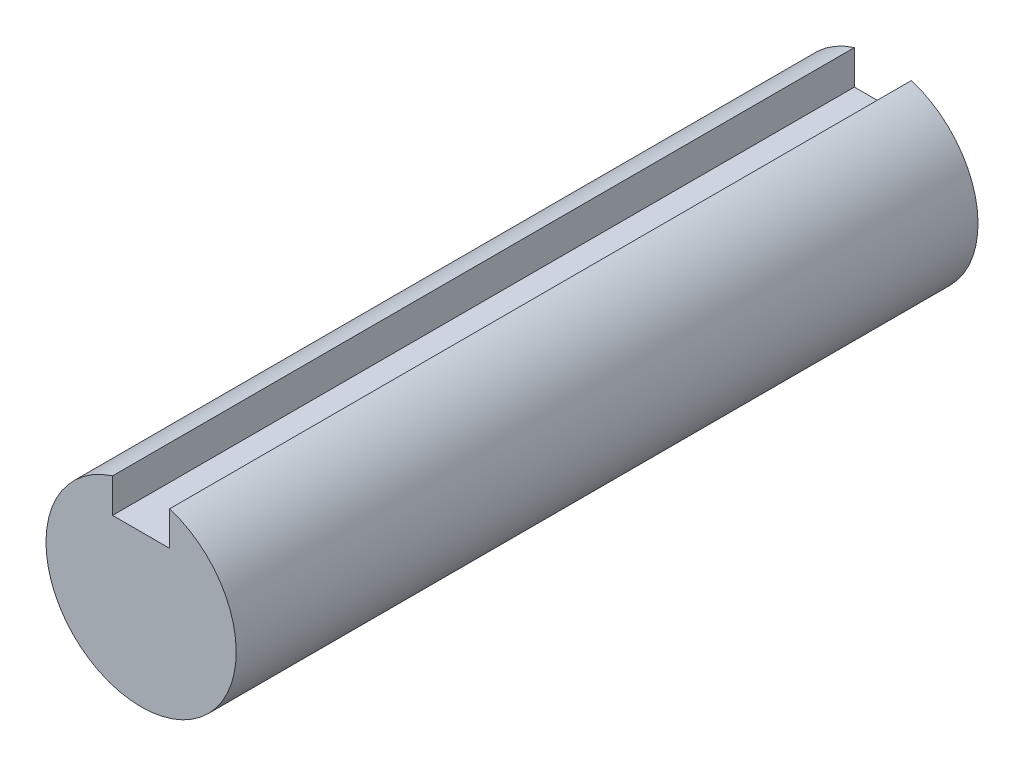
ISO-10303-21;
HEADER;
FILE_DESCRIPTION(('STEP AP214'),'2;1');
FILE_NAME('part.step','',(''),(''),'','','');
FILE_SCHEMA(('AUTOMOTIVE_DESIGN { 1 0 10303 214 1 1 1 1 }'));
ENDSEC;
DATA;
#1=APPLICATION_CONTEXT('core data for automotive mechanical design processes');
#2=APPLICATION_PROTOCOL_DEFINITION('international standard','automotive_design',2000,#1);
#3=PRODUCT_CONTEXT('',#1,'mechanical');
#4=PRODUCT('Part','Part','',(#3));
#5=PRODUCT_RELATED_PRODUCT_CATEGORY('part','',(#4));
#6=PRODUCT_DEFINITION_FORMATION('','',#4);
#7=PRODUCT_DEFINITION_CONTEXT('part definition',#1,'design');
#8=PRODUCT_DEFINITION('design','',#6,#7);
#9=PRODUCT_DEFINITION_SHAPE('','',#8);
#10=(LENGTH_UNIT() NAMED_UNIT(*) SI_UNIT(.MILLI.,.METRE.));
#11=(NAMED_UNIT(*) PLANE_ANGLE_UNIT() SI_UNIT($,.RADIAN.));
#12=(NAMED_UNIT(*) SI_UNIT($,.STERADIAN.) SOLID_ANGLE_UNIT());
#13=UNCERTAINTY_MEASURE_WITH_UNIT(LENGTH_MEASURE(1.E-05),#10,'distance_accuracy_value','');
#14=(GEOMETRIC_REPRESENTATION_CONTEXT(3) GLOBAL_UNCERTAINTY_ASSIGNED_CONTEXT((#13)) GLOBAL_UNIT_ASSIGNED_CONTEXT((#10,
#11,#12)) REPRESENTATION_CONTEXT('',''));
#15=CARTESIAN_POINT('',(0.,0.,0.));
#16=DIRECTION('',(0.,0.,1.));
#17=DIRECTION('',(1.,0.,0.));
#18=AXIS2_PLACEMENT_3D('',#15,#16,#17);
#19=CARTESIAN_POINT('',(0.,2.96969600708473,39.));
#20=DIRECTION('',(0.,1.,0.));
#21=DIRECTION('',(0.,0.,1.));
#22=AXIS2_PLACEMENT_3D('',#19,#20,#21);
#23=PLANE('',#22);
#24=DIRECTION('',(1.,0.,0.));
#25=VECTOR('',#24,1.);
#26=CARTESIAN_POINT('',(0.,2.96969600708473,0.));
#27=LINE('',#26,#25);
#28=CARTESIAN_POINT('',(-1.5,2.96969600708473,0.));
#29=VERTEX_POINT('',#28);
#30=CARTESIAN_POINT('',(1.5,2.96969600708473,0.));
#31=VERTEX_POINT('',#30);
#32=EDGE_CURVE('E98',#29,#31,#27,.T.);
#33=ORIENTED_EDGE('',*,*,#32,.F.);
#34=DIRECTION('',(0.,0.,-1.));
#35=VECTOR('',#34,1.);
#36=CARTESIAN_POINT('',(-1.5,2.96969600708473,39.));
#37=LINE('',#36,#35);
#38=CARTESIAN_POINT('',(-1.5,2.96969600708473,39.));
#39=VERTEX_POINT('',#38);
#40=EDGE_CURVE('E11',#39,#29,#37,.T.);
#41=ORIENTED_EDGE('',*,*,#40,.F.);
#42=DIRECTION('',(1.,0.,0.));
#43=VECTOR('',#42,1.);
#44=CARTESIAN_POINT('',(0.,2.96969600708473,39.));
#45=LINE('',#44,#43);
#46=CARTESIAN_POINT('',(1.5,2.96969600708473,39.));
#47=VERTEX_POINT('',#46);
#48=EDGE_CURVE('E83',#39,#47,#45,.T.);
#49=ORIENTED_EDGE('',*,*,#48,.T.);
#50=DIRECTION('',(0.,0.,-1.));
#51=VECTOR('',#50,1.);
#52=CARTESIAN_POINT('',(1.5,2.96969600708473,39.));
#53=LINE('',#52,#51);
#54=EDGE_CURVE('E51',#47,#31,#53,.T.);
#55=ORIENTED_EDGE('',*,*,#54,.T.);
#56=EDGE_LOOP('',(#33,#41,#49,#55));
#57=FACE_BOUND('',#56,.T.);
#58=ADVANCED_FACE('F35',(#57),#23,.T.);
#59=CARTESIAN_POINT('',(-1.5,0.,39.));
#60=DIRECTION('',(-1.,0.,0.));
#61=DIRECTION('',(0.,0.,1.));
#62=AXIS2_PLACEMENT_3D('',#59,#60,#61);
#63=PLANE('',#62);
#64=DIRECTION('',(0.,1.,0.));
#65=VECTOR('',#64,1.);
#66=CARTESIAN_POINT('',(-1.5,0.,0.));
#67=LINE('',#66,#65);
#68=CARTESIAN_POINT('',(-1.5,4.76969600708473,0.));
#69=VERTEX_POINT('',#68);
#70=EDGE_CURVE('E89',#29,#69,#67,.T.);
#71=ORIENTED_EDGE('',*,*,#70,.T.);
#72=DIRECTION('',(0.,0.,-1.));
#73=VECTOR('',#72,1.);
#74=CARTESIAN_POINT('',(-1.5,4.76969600708473,39.));
#75=LINE('',#74,#73);
#76=CARTESIAN_POINT('',(-1.5,4.76969600708473,39.));
#77=VERTEX_POINT('',#76);
#78=EDGE_CURVE('E43',#77,#69,#75,.T.);
#79=ORIENTED_EDGE('',*,*,#78,.F.);
#80=DIRECTION('',(0.,1.,0.));
#81=VECTOR('',#80,1.);
#82=CARTESIAN_POINT('',(-1.5,0.,39.));
#83=LINE('',#82,#81);
#84=EDGE_CURVE('E77',#39,#77,#83,.T.);
#85=ORIENTED_EDGE('',*,*,#84,.F.);
#86=ORIENTED_EDGE('',*,*,#40,.T.);
#87=EDGE_LOOP('',(#71,#79,#85,#86));
#88=FACE_BOUND('',#87,.T.);
#89=ADVANCED_FACE('F87',(#88),#63,.F.);
#90=CARTESIAN_POINT('',(0.,0.,39.));
#91=DIRECTION('',(0.,0.,-1.));
#92=DIRECTION('',(-1.,0.,0.));
#93=AXIS2_PLACEMENT_3D('',#90,#91,#92);
#94=CYLINDRICAL_SURFACE('',#93,5.);
#95=CARTESIAN_POINT('',(0.,0.,0.));
#96=DIRECTION('',(0.,0.,1.));
#97=DIRECTION('',(1.,0.,0.));
#98=AXIS2_PLACEMENT_3D('',#95,#96,#97);
#99=CIRCLE('',#98,5.);
#100=CARTESIAN_POINT('',(1.5,4.76969600708473,0.));
#101=VERTEX_POINT('',#100);
#102=EDGE_CURVE('E101',#69,#101,#99,.T.);
#103=ORIENTED_EDGE('',*,*,#102,.T.);
#104=DIRECTION('',(0.,0.,-1.));
#105=VECTOR('',#104,1.);
#106=CARTESIAN_POINT('',(1.5,4.76969600708473,39.));
#107=LINE('',#106,#105);
#108=CARTESIAN_POINT('',(1.5,4.76969600708473,39.));
#109=VERTEX_POINT('',#108);
#110=EDGE_CURVE('E65',#109,#101,#107,.T.);
#111=ORIENTED_EDGE('',*,*,#110,.F.);
#112=CARTESIAN_POINT('',(0.,0.,39.));
#113=DIRECTION('',(0.,0.,1.));
#114=DIRECTION('',(1.,0.,0.));
#115=AXIS2_PLACEMENT_3D('',#112,#113,#114);
#116=CIRCLE('',#115,5.);
#117=EDGE_CURVE('E82',#77,#109,#116,.T.);
#118=ORIENTED_EDGE('',*,*,#117,.F.);
#119=ORIENTED_EDGE('',*,*,#78,.T.);
#120=EDGE_LOOP('',(#103,#111,#118,#119));
#121=FACE_BOUND('',#120,.T.);
#122=ADVANCED_FACE('F92',(#121),#94,.T.);
#123=CARTESIAN_POINT('',(1.5,0.,39.));
#124=DIRECTION('',(-1.,0.,0.));
#125=DIRECTION('',(0.,0.,1.));
#126=AXIS2_PLACEMENT_3D('',#123,#124,#125);
#127=PLANE('',#126);
#128=DIRECTION('',(0.,1.,0.));
#129=VECTOR('',#128,1.);
#130=CARTESIAN_POINT('',(1.5,0.,0.));
#131=LINE('',#130,#129);
#132=EDGE_CURVE('E103',#31,#101,#131,.T.);
#133=ORIENTED_EDGE('',*,*,#132,.F.);
#134=ORIENTED_EDGE('',*,*,#54,.F.);
#135=DIRECTION('',(0.,1.,0.));
#136=VECTOR('',#135,1.);
#137=CARTESIAN_POINT('',(1.5,0.,39.));
#138=LINE('',#137,#136);
#139=EDGE_CURVE('E93',#47,#109,#138,.T.);
#140=ORIENTED_EDGE('',*,*,#139,.T.);
#141=ORIENTED_EDGE('',*,*,#110,.T.);
#142=EDGE_LOOP('',(#133,#134,#140,#141));
#143=FACE_BOUND('',#142,.T.);
#144=ADVANCED_FACE('F108',(#143),#127,.T.);
#145=CARTESIAN_POINT('',(0.,0.,39.));
#146=DIRECTION('',(0.,0.,1.));
#147=DIRECTION('',(1.,0.,0.));
#148=AXIS2_PLACEMENT_3D('',#145,#146,#147);
#149=PLANE('',#148);
#150=ORIENTED_EDGE('',*,*,#48,.F.);
#151=ORIENTED_EDGE('',*,*,#84,.T.);
#152=ORIENTED_EDGE('',*,*,#117,.T.);
#153=ORIENTED_EDGE('',*,*,#139,.F.);
#154=EDGE_LOOP('',(#150,#151,#152,#153));
#155=FACE_BOUND('',#154,.T.);
#156=ADVANCED_FACE('F79',(#155),#149,.T.);
#157=CARTESIAN_POINT('',(0.,0.,0.));
#158=DIRECTION('',(0.,0.,1.));
#159=DIRECTION('',(1.,0.,0.));
#160=AXIS2_PLACEMENT_3D('',#157,#158,#159);
#161=PLANE('',#160);
#162=ORIENTED_EDGE('',*,*,#32,.T.);
#163=ORIENTED_EDGE('',*,*,#132,.T.);
#164=ORIENTED_EDGE('',*,*,#102,.F.);
#165=ORIENTED_EDGE('',*,*,#70,.F.);
#166=EDGE_LOOP('',(#162,#163,#164,#165));
#167=FACE_BOUND('',#166,.T.);
#168=ADVANCED_FACE('F115',(#167),#161,.F.);
#169=CLOSED_SHELL('',(#58,#89,#122,#144,#156,#168));
#170=MANIFOLD_SOLID_BREP('B2',#169);
#171=ADVANCED_BREP_SHAPE_REPRESENTATION('',(#18,#170),#14);
#172=SHAPE_DEFINITION_REPRESENTATION(#9,#171);
ENDSEC;
END-ISO-10303-21;
